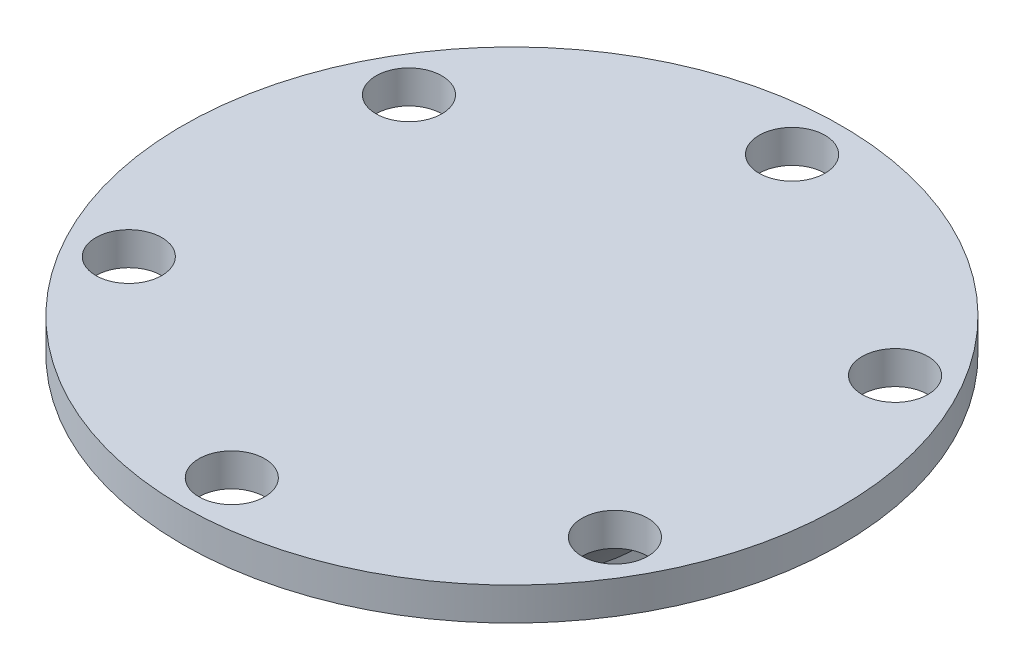
ISO-10303-21;
HEADER;
FILE_DESCRIPTION(('STEP AP214'),'2;1');
FILE_NAME('part.step','',(''),(''),'','','');
FILE_SCHEMA(('AUTOMOTIVE_DESIGN { 1 0 10303 214 1 1 1 1 }'));
ENDSEC;
DATA;
#1=APPLICATION_CONTEXT('core data for automotive mechanical design processes');
#2=APPLICATION_PROTOCOL_DEFINITION('international standard','automotive_design',2000,#1);
#3=PRODUCT_CONTEXT('',#1,'mechanical');
#4=PRODUCT('Part','Part','',(#3));
#5=PRODUCT_RELATED_PRODUCT_CATEGORY('part','',(#4));
#6=PRODUCT_DEFINITION_FORMATION('','',#4);
#7=PRODUCT_DEFINITION_CONTEXT('part definition',#1,'design');
#8=PRODUCT_DEFINITION('design','',#6,#7);
#9=PRODUCT_DEFINITION_SHAPE('','',#8);
#10=(LENGTH_UNIT() NAMED_UNIT(*) SI_UNIT(.MILLI.,.METRE.));
#11=(NAMED_UNIT(*) PLANE_ANGLE_UNIT() SI_UNIT($,.RADIAN.));
#12=(NAMED_UNIT(*) SI_UNIT($,.STERADIAN.) SOLID_ANGLE_UNIT());
#13=UNCERTAINTY_MEASURE_WITH_UNIT(LENGTH_MEASURE(1.E-05),#10,'distance_accuracy_value','');
#14=(GEOMETRIC_REPRESENTATION_CONTEXT(3) GLOBAL_UNCERTAINTY_ASSIGNED_CONTEXT((#13)) GLOBAL_UNIT_ASSIGNED_CONTEXT((#10,
#11,#12)) REPRESENTATION_CONTEXT('',''));
#15=CARTESIAN_POINT('',(0.,0.,0.));
#16=DIRECTION('',(0.,0.,1.));
#17=DIRECTION('',(1.,0.,0.));
#18=AXIS2_PLACEMENT_3D('',#15,#16,#17);
#19=CARTESIAN_POINT('',(0.,12.7,0.));
#20=DIRECTION('',(0.,-1.,0.));
#21=DIRECTION('',(0.,0.,-1.));
#22=AXIS2_PLACEMENT_3D('',#19,#20,#21);
#23=CYLINDRICAL_SURFACE('',#22,127.);
#24=CARTESIAN_POINT('',(0.,12.7,0.));
#25=DIRECTION('',(0.,1.,0.));
#26=DIRECTION('',(0.,0.,1.));
#27=AXIS2_PLACEMENT_3D('',#24,#25,#26);
#28=CIRCLE('',#27,127.);
#29=CARTESIAN_POINT('',(0.,12.7,127.));
#30=VERTEX_POINT('',#29);
#31=EDGE_CURVE('E42',#30,#30,#28,.T.);
#32=ORIENTED_EDGE('',*,*,#31,.F.);
#33=EDGE_LOOP('',(#32));
#34=FACE_BOUND('',#33,.T.);
#35=CARTESIAN_POINT('',(0.,0.,0.));
#36=DIRECTION('',(0.,1.,0.));
#37=DIRECTION('',(0.,0.,1.));
#38=AXIS2_PLACEMENT_3D('',#35,#36,#37);
#39=CIRCLE('',#38,127.);
#40=CARTESIAN_POINT('',(0.,0.,127.));
#41=VERTEX_POINT('',#40);
#42=EDGE_CURVE('E46',#41,#41,#39,.T.);
#43=ORIENTED_EDGE('',*,*,#42,.T.);
#44=EDGE_LOOP('',(#43));
#45=FACE_BOUND('',#44,.T.);
#46=ADVANCED_FACE('F31',(#34,#45),#23,.T.);
#47=CARTESIAN_POINT('',(0.,12.7,0.));
#48=DIRECTION('',(0.,1.,0.));
#49=DIRECTION('',(0.,0.,1.));
#50=AXIS2_PLACEMENT_3D('',#47,#48,#49);
#51=PLANE('',#50);
#52=CARTESIAN_POINT('',(0.,12.7,-107.95));
#53=DIRECTION('',(0.,1.,0.));
#54=DIRECTION('',(0.,0.,1.));
#55=AXIS2_PLACEMENT_3D('',#52,#53,#54);
#56=CIRCLE('',#55,12.7);
#57=CARTESIAN_POINT('',(0.,12.7,-95.25));
#58=VERTEX_POINT('',#57);
#59=EDGE_CURVE('E77',#58,#58,#56,.T.);
#60=ORIENTED_EDGE('',*,*,#59,.F.);
#61=EDGE_LOOP('',(#60));
#62=FACE_BOUND('',#61,.T.);
#63=CARTESIAN_POINT('',(-93.6625,12.7,53.975));
#64=DIRECTION('',(0.,1.,0.));
#65=DIRECTION('',(0.,0.,1.));
#66=AXIS2_PLACEMENT_3D('',#63,#64,#65);
#67=CIRCLE('',#66,12.7);
#68=CARTESIAN_POINT('',(-93.6625,12.7,66.675));
#69=VERTEX_POINT('',#68);
#70=EDGE_CURVE('E78',#69,#69,#67,.T.);
#71=ORIENTED_EDGE('',*,*,#70,.F.);
#72=EDGE_LOOP('',(#71));
#73=FACE_BOUND('',#72,.T.);
#74=CARTESIAN_POINT('',(-93.6625,12.7,-53.975));
#75=DIRECTION('',(0.,1.,0.));
#76=DIRECTION('',(0.,0.,1.));
#77=AXIS2_PLACEMENT_3D('',#74,#75,#76);
#78=CIRCLE('',#77,12.7);
#79=CARTESIAN_POINT('',(-93.6625,12.7,-41.275));
#80=VERTEX_POINT('',#79);
#81=EDGE_CURVE('E52',#80,#80,#78,.T.);
#82=ORIENTED_EDGE('',*,*,#81,.F.);
#83=EDGE_LOOP('',(#82));
#84=FACE_BOUND('',#83,.T.);
#85=CARTESIAN_POINT('',(93.6625,12.7,-53.975));
#86=DIRECTION('',(0.,1.,0.));
#87=DIRECTION('',(0.,0.,1.));
#88=AXIS2_PLACEMENT_3D('',#85,#86,#87);
#89=CIRCLE('',#88,12.7);
#90=CARTESIAN_POINT('',(93.6625,12.7,-41.275));
#91=VERTEX_POINT('',#90);
#92=EDGE_CURVE('E59',#91,#91,#89,.T.);
#93=ORIENTED_EDGE('',*,*,#92,.F.);
#94=EDGE_LOOP('',(#93));
#95=FACE_BOUND('',#94,.T.);
#96=CARTESIAN_POINT('',(93.6625,12.7,53.975));
#97=DIRECTION('',(0.,1.,0.));
#98=DIRECTION('',(0.,0.,1.));
#99=AXIS2_PLACEMENT_3D('',#96,#97,#98);
#100=CIRCLE('',#99,12.7);
#101=CARTESIAN_POINT('',(93.6625,12.7,66.675));
#102=VERTEX_POINT('',#101);
#103=EDGE_CURVE('E65',#102,#102,#100,.T.);
#104=ORIENTED_EDGE('',*,*,#103,.F.);
#105=EDGE_LOOP('',(#104));
#106=FACE_BOUND('',#105,.T.);
#107=CARTESIAN_POINT('',(0.,12.7,107.95));
#108=DIRECTION('',(0.,1.,0.));
#109=DIRECTION('',(0.,0.,1.));
#110=AXIS2_PLACEMENT_3D('',#107,#108,#109);
#111=CIRCLE('',#110,12.7);
#112=CARTESIAN_POINT('',(0.,12.7,120.65));
#113=VERTEX_POINT('',#112);
#114=EDGE_CURVE('E71',#113,#113,#111,.T.);
#115=ORIENTED_EDGE('',*,*,#114,.F.);
#116=EDGE_LOOP('',(#115));
#117=FACE_BOUND('',#116,.T.);
#118=ORIENTED_EDGE('',*,*,#31,.T.);
#119=EDGE_LOOP('',(#118));
#120=FACE_BOUND('',#119,.T.);
#121=ADVANCED_FACE('F104',(#62,#73,#84,#95,#106,#117,#120),#51,.T.);
#122=CARTESIAN_POINT('',(0.,0.,0.));
#123=DIRECTION('',(0.,1.,0.));
#124=DIRECTION('',(0.,0.,1.));
#125=AXIS2_PLACEMENT_3D('',#122,#123,#124);
#126=PLANE('',#125);
#127=CARTESIAN_POINT('',(0.,0.,0.));
#128=DIRECTION('',(0.,1.,0.));
#129=DIRECTION('',(0.,0.,1.));
#130=AXIS2_PLACEMENT_3D('',#127,#128,#129);
#131=CIRCLE('',#130,88.9);
#132=CARTESIAN_POINT('',(0.,0.,88.9));
#133=VERTEX_POINT('',#132);
#134=EDGE_CURVE('E38',#133,#133,#131,.F.);
#135=ORIENTED_EDGE('',*,*,#134,.F.);
#136=EDGE_LOOP('',(#135));
#137=FACE_BOUND('',#136,.T.);
#138=CARTESIAN_POINT('',(0.,0.,-107.95));
#139=DIRECTION('',(0.,1.,0.));
#140=DIRECTION('',(0.,0.,1.));
#141=AXIS2_PLACEMENT_3D('',#138,#139,#140);
#142=CIRCLE('',#141,12.7);
#143=CARTESIAN_POINT('',(0.,0.,-95.25));
#144=VERTEX_POINT('',#143);
#145=EDGE_CURVE('E50',#144,#144,#142,.T.);
#146=ORIENTED_EDGE('',*,*,#145,.T.);
#147=EDGE_LOOP('',(#146));
#148=FACE_BOUND('',#147,.T.);
#149=CARTESIAN_POINT('',(-93.6625,0.,53.975));
#150=DIRECTION('',(0.,1.,0.));
#151=DIRECTION('',(0.,0.,1.));
#152=AXIS2_PLACEMENT_3D('',#149,#150,#151);
#153=CIRCLE('',#152,12.7);
#154=CARTESIAN_POINT('',(-93.6625,0.,66.675));
#155=VERTEX_POINT('',#154);
#156=EDGE_CURVE('E56',#155,#155,#153,.T.);
#157=ORIENTED_EDGE('',*,*,#156,.T.);
#158=EDGE_LOOP('',(#157));
#159=FACE_BOUND('',#158,.T.);
#160=CARTESIAN_POINT('',(-93.6625,0.,-53.975));
#161=DIRECTION('',(0.,1.,0.));
#162=DIRECTION('',(0.,0.,1.));
#163=AXIS2_PLACEMENT_3D('',#160,#161,#162);
#164=CIRCLE('',#163,12.7);
#165=CARTESIAN_POINT('',(-93.6625,0.,-41.275));
#166=VERTEX_POINT('',#165);
#167=EDGE_CURVE('E55',#166,#166,#164,.T.);
#168=ORIENTED_EDGE('',*,*,#167,.T.);
#169=EDGE_LOOP('',(#168));
#170=FACE_BOUND('',#169,.T.);
#171=CARTESIAN_POINT('',(93.6625,0.,-53.975));
#172=DIRECTION('',(0.,1.,0.));
#173=DIRECTION('',(0.,0.,1.));
#174=AXIS2_PLACEMENT_3D('',#171,#172,#173);
#175=CIRCLE('',#174,12.7);
#176=CARTESIAN_POINT('',(93.6625,0.,-41.275));
#177=VERTEX_POINT('',#176);
#178=EDGE_CURVE('E62',#177,#177,#175,.T.);
#179=ORIENTED_EDGE('',*,*,#178,.T.);
#180=EDGE_LOOP('',(#179));
#181=FACE_BOUND('',#180,.T.);
#182=CARTESIAN_POINT('',(93.6625,0.,53.975));
#183=DIRECTION('',(0.,1.,0.));
#184=DIRECTION('',(0.,0.,1.));
#185=AXIS2_PLACEMENT_3D('',#182,#183,#184);
#186=CIRCLE('',#185,12.7);
#187=CARTESIAN_POINT('',(93.6625,0.,66.675));
#188=VERTEX_POINT('',#187);
#189=EDGE_CURVE('E68',#188,#188,#186,.T.);
#190=ORIENTED_EDGE('',*,*,#189,.T.);
#191=EDGE_LOOP('',(#190));
#192=FACE_BOUND('',#191,.T.);
#193=CARTESIAN_POINT('',(0.,0.,107.95));
#194=DIRECTION('',(0.,1.,0.));
#195=DIRECTION('',(0.,0.,1.));
#196=AXIS2_PLACEMENT_3D('',#193,#194,#195);
#197=CIRCLE('',#196,12.7);
#198=CARTESIAN_POINT('',(0.,0.,120.65));
#199=VERTEX_POINT('',#198);
#200=EDGE_CURVE('E74',#199,#199,#197,.T.);
#201=ORIENTED_EDGE('',*,*,#200,.T.);
#202=EDGE_LOOP('',(#201));
#203=FACE_BOUND('',#202,.T.);
#204=ORIENTED_EDGE('',*,*,#42,.F.);
#205=EDGE_LOOP('',(#204));
#206=FACE_BOUND('',#205,.T.);
#207=ADVANCED_FACE('F109',(#137,#148,#159,#170,#181,#192,#203,#206),#126,.F.);
#208=CARTESIAN_POINT('',(0.,0.,107.95));
#209=DIRECTION('',(0.,1.,0.));
#210=DIRECTION('',(0.,0.,1.));
#211=AXIS2_PLACEMENT_3D('',#208,#209,#210);
#212=CYLINDRICAL_SURFACE('',#211,12.7);
#213=ORIENTED_EDGE('',*,*,#200,.F.);
#214=EDGE_LOOP('',(#213));
#215=FACE_BOUND('',#214,.T.);
#216=ORIENTED_EDGE('',*,*,#114,.T.);
#217=EDGE_LOOP('',(#216));
#218=FACE_BOUND('',#217,.T.);
#219=ADVANCED_FACE('F116',(#215,#218),#212,.F.);
#220=CARTESIAN_POINT('',(93.6625,0.,53.975));
#221=DIRECTION('',(0.,1.,0.));
#222=DIRECTION('',(0.,0.,1.));
#223=AXIS2_PLACEMENT_3D('',#220,#221,#222);
#224=CYLINDRICAL_SURFACE('',#223,12.7);
#225=ORIENTED_EDGE('',*,*,#189,.F.);
#226=EDGE_LOOP('',(#225));
#227=FACE_BOUND('',#226,.T.);
#228=ORIENTED_EDGE('',*,*,#103,.T.);
#229=EDGE_LOOP('',(#228));
#230=FACE_BOUND('',#229,.T.);
#231=ADVANCED_FACE('F127',(#227,#230),#224,.F.);
#232=CARTESIAN_POINT('',(93.6625,0.,-53.975));
#233=DIRECTION('',(0.,1.,0.));
#234=DIRECTION('',(0.,0.,1.));
#235=AXIS2_PLACEMENT_3D('',#232,#233,#234);
#236=CYLINDRICAL_SURFACE('',#235,12.7);
#237=ORIENTED_EDGE('',*,*,#178,.F.);
#238=EDGE_LOOP('',(#237));
#239=FACE_BOUND('',#238,.T.);
#240=ORIENTED_EDGE('',*,*,#92,.T.);
#241=EDGE_LOOP('',(#240));
#242=FACE_BOUND('',#241,.T.);
#243=ADVANCED_FACE('F123',(#239,#242),#236,.F.);
#244=CARTESIAN_POINT('',(-93.6625,0.,-53.975));
#245=DIRECTION('',(0.,1.,0.));
#246=DIRECTION('',(0.,0.,1.));
#247=AXIS2_PLACEMENT_3D('',#244,#245,#246);
#248=CYLINDRICAL_SURFACE('',#247,12.7);
#249=ORIENTED_EDGE('',*,*,#167,.F.);
#250=EDGE_LOOP('',(#249));
#251=FACE_BOUND('',#250,.T.);
#252=ORIENTED_EDGE('',*,*,#81,.T.);
#253=EDGE_LOOP('',(#252));
#254=FACE_BOUND('',#253,.T.);
#255=ADVANCED_FACE('F119',(#251,#254),#248,.F.);
#256=CARTESIAN_POINT('',(-93.6625,0.,53.975));
#257=DIRECTION('',(0.,1.,0.));
#258=DIRECTION('',(0.,0.,1.));
#259=AXIS2_PLACEMENT_3D('',#256,#257,#258);
#260=CYLINDRICAL_SURFACE('',#259,12.7);
#261=ORIENTED_EDGE('',*,*,#156,.F.);
#262=EDGE_LOOP('',(#261));
#263=FACE_BOUND('',#262,.T.);
#264=ORIENTED_EDGE('',*,*,#70,.T.);
#265=EDGE_LOOP('',(#264));
#266=FACE_BOUND('',#265,.T.);
#267=ADVANCED_FACE('F122',(#263,#266),#260,.F.);
#268=CARTESIAN_POINT('',(0.,0.,-107.95));
#269=DIRECTION('',(0.,1.,0.));
#270=DIRECTION('',(0.,0.,1.));
#271=AXIS2_PLACEMENT_3D('',#268,#269,#270);
#272=CYLINDRICAL_SURFACE('',#271,12.7);
#273=ORIENTED_EDGE('',*,*,#145,.F.);
#274=EDGE_LOOP('',(#273));
#275=FACE_BOUND('',#274,.T.);
#276=ORIENTED_EDGE('',*,*,#59,.T.);
#277=EDGE_LOOP('',(#276));
#278=FACE_BOUND('',#277,.T.);
#279=ADVANCED_FACE('F101',(#275,#278),#272,.F.);
#280=CARTESIAN_POINT('',(0.,-39.6875,0.));
#281=DIRECTION('',(0.,1.,0.));
#282=DIRECTION('',(0.,0.,1.));
#283=AXIS2_PLACEMENT_3D('',#280,#281,#282);
#284=CONICAL_SURFACE('',#283,49.2125000000001,0.785398163397448);
#285=ORIENTED_EDGE('',*,*,#134,.T.);
#286=EDGE_LOOP('',(#285));
#287=FACE_BOUND('',#286,.T.);
#288=CARTESIAN_POINT('',(0.,-39.6875,0.));
#289=DIRECTION('',(0.,-1.,0.));
#290=DIRECTION('',(0.,0.,-1.));
#291=AXIS2_PLACEMENT_3D('',#288,#289,#290);
#292=CIRCLE('',#291,49.2125000000001);
#293=CARTESIAN_POINT('',(0.,-39.6875,49.2125000000001));
#294=VERTEX_POINT('',#293);
#295=EDGE_CURVE('E10',#294,#294,#292,.T.);
#296=ORIENTED_EDGE('',*,*,#295,.F.);
#297=EDGE_LOOP('',(#296));
#298=FACE_BOUND('',#297,.T.);
#299=ADVANCED_FACE('F33',(#287,#298),#284,.T.);
#300=CARTESIAN_POINT('',(0.,-44.45,0.));
#301=DIRECTION('',(0.,1.,0.));
#302=DIRECTION('',(0.,0.,1.));
#303=AXIS2_PLACEMENT_3D('',#300,#301,#302);
#304=CYLINDRICAL_SURFACE('',#303,49.2125000000001);
#305=CARTESIAN_POINT('',(0.,-44.45,0.));
#306=DIRECTION('',(0.,-1.,0.));
#307=DIRECTION('',(0.,0.,-1.));
#308=AXIS2_PLACEMENT_3D('',#305,#306,#307);
#309=CIRCLE('',#308,49.2125000000001);
#310=CARTESIAN_POINT('',(0.,-44.45,49.2125000000001));
#311=VERTEX_POINT('',#310);
#312=EDGE_CURVE('E81',#311,#311,#309,.T.);
#313=CARTESIAN_POINT('',(0.,-44.45,49.2125000000001));
#314=CARTESIAN_POINT('',(0.,-44.400390625,49.2125000000001));
#315=CARTESIAN_POINT('',(0.,-44.35078125,49.2125000000001));
#316=CARTESIAN_POINT('',(0.,-44.2515625,49.2125000000001));
#317=CARTESIAN_POINT('',(0.,-44.201953125,49.2125000000001));
#318=CARTESIAN_POINT('',(0.,-44.102734375,49.2125000000001));
#319=CARTESIAN_POINT('',(0.,-44.053125,49.2125000000001));
#320=CARTESIAN_POINT('',(0.,-43.95390625,49.2125000000001));
#321=CARTESIAN_POINT('',(0.,-43.904296875,49.2125000000001));
#322=CARTESIAN_POINT('',(0.,-43.805078125,49.2125000000001));
#323=CARTESIAN_POINT('',(0.,-43.75546875,49.2125000000001));
#324=CARTESIAN_POINT('',(0.,-43.65625,49.2125000000001));
#325=CARTESIAN_POINT('',(0.,-43.606640625,49.2125000000001));
#326=CARTESIAN_POINT('',(0.,-43.507421875,49.2125000000001));
#327=CARTESIAN_POINT('',(0.,-43.4578125,49.2125000000001));
#328=CARTESIAN_POINT('',(0.,-43.35859375,49.2125000000001));
#329=CARTESIAN_POINT('',(0.,-43.308984375,49.2125000000001));
#330=CARTESIAN_POINT('',(0.,-43.209765625,49.2125000000001));
#331=CARTESIAN_POINT('',(0.,-43.16015625,49.2125000000001));
#332=CARTESIAN_POINT('',(0.,-43.0609375,49.2125000000001));
#333=CARTESIAN_POINT('',(0.,-43.011328125,49.2125000000001));
#334=CARTESIAN_POINT('',(0.,-42.912109375,49.2125000000001));
#335=CARTESIAN_POINT('',(0.,-42.8625,49.2125000000001));
#336=CARTESIAN_POINT('',(0.,-42.76328125,49.2125000000001));
#337=CARTESIAN_POINT('',(0.,-42.713671875,49.2125000000001));
#338=CARTESIAN_POINT('',(0.,-42.614453125,49.2125000000001));
#339=CARTESIAN_POINT('',(0.,-42.56484375,49.2125000000001));
#340=CARTESIAN_POINT('',(0.,-42.465625,49.2125000000001));
#341=CARTESIAN_POINT('',(0.,-42.416015625,49.2125000000001));
#342=CARTESIAN_POINT('',(0.,-42.316796875,49.2125000000001));
#343=CARTESIAN_POINT('',(0.,-42.2671875,49.2125000000001));
#344=CARTESIAN_POINT('',(0.,-42.16796875,49.2125000000001));
#345=CARTESIAN_POINT('',(0.,-42.118359375,49.2125000000001));
#346=CARTESIAN_POINT('',(0.,-42.019140625,49.2125000000001));
#347=CARTESIAN_POINT('',(0.,-41.96953125,49.2125000000001));
#348=CARTESIAN_POINT('',(0.,-41.8703125,49.2125000000001));
#349=CARTESIAN_POINT('',(0.,-41.820703125,49.2125000000001));
#350=CARTESIAN_POINT('',(0.,-41.721484375,49.2125000000001));
#351=CARTESIAN_POINT('',(0.,-41.671875,49.2125000000001));
#352=CARTESIAN_POINT('',(0.,-41.57265625,49.2125000000001));
#353=CARTESIAN_POINT('',(0.,-41.523046875,49.2125000000001));
#354=CARTESIAN_POINT('',(0.,-41.423828125,49.2125000000001));
#355=CARTESIAN_POINT('',(0.,-41.37421875,49.2125000000001));
#356=CARTESIAN_POINT('',(0.,-41.275,49.2125000000001));
#357=CARTESIAN_POINT('',(0.,-41.225390625,49.2125000000001));
#358=CARTESIAN_POINT('',(0.,-41.126171875,49.2125000000001));
#359=CARTESIAN_POINT('',(0.,-41.0765625,49.2125000000001));
#360=CARTESIAN_POINT('',(0.,-40.97734375,49.2125000000001));
#361=CARTESIAN_POINT('',(0.,-40.927734375,49.2125000000001));
#362=CARTESIAN_POINT('',(0.,-40.828515625,49.2125000000001));
#363=CARTESIAN_POINT('',(0.,-40.77890625,49.2125000000001));
#364=CARTESIAN_POINT('',(0.,-40.6796875,49.2125000000001));
#365=CARTESIAN_POINT('',(0.,-40.630078125,49.2125000000001));
#366=CARTESIAN_POINT('',(0.,-40.530859375,49.2125000000001));
#367=CARTESIAN_POINT('',(0.,-40.48125,49.2125000000001));
#368=CARTESIAN_POINT('',(0.,-40.38203125,49.2125000000001));
#369=CARTESIAN_POINT('',(0.,-40.332421875,49.2125000000001));
#370=CARTESIAN_POINT('',(0.,-40.233203125,49.2125000000001));
#371=CARTESIAN_POINT('',(0.,-40.18359375,49.2125000000001));
#372=CARTESIAN_POINT('',(0.,-40.084375,49.2125000000001));
#373=CARTESIAN_POINT('',(0.,-40.034765625,49.2125000000001));
#374=CARTESIAN_POINT('',(0.,-39.935546875,49.2125000000001));
#375=CARTESIAN_POINT('',(0.,-39.8859375,49.2125000000001));
#376=CARTESIAN_POINT('',(0.,-39.78671875,49.2125000000001));
#377=CARTESIAN_POINT('',(0.,-39.737109375,49.2125000000001));
#378=CARTESIAN_POINT('',(0.,-39.6875,49.2125000000001));
#379=B_SPLINE_CURVE_WITH_KNOTS('',3,(#313,#314,#315,#316,#317,#318,#319,#320,#321,#322,#323,
#324,#325,#326,#327,#328,#329,#330,#331,#332,#333,#334,#335,#336,#337,#338,#339,#340,#341,#342,
#343,#344,#345,#346,#347,#348,#349,#350,#351,#352,#353,#354,#355,#356,#357,#358,#359,#360,#361,
#362,#363,#364,#365,#366,#367,#368,#369,#370,#371,#372,#373,#374,#375,#376,#377,#378),
.UNSPECIFIED.,.F.,.F.,(4,2,2,2,2,2,2,2,2,2,2,2,2,2,2,2,2,2,2,2,2,2,2,2,2,2,2,2,2,2,2,2,4),(0.,
0.148828125,0.29765625,0.446484375,0.5953125,0.744140625,0.892968750000001,1.041796875,1.190625,
1.339453125,1.48828125,1.637109375,1.7859375,1.934765625,2.08359375,2.232421875,2.38125,
2.530078125,2.67890625,2.827734375,2.9765625,3.125390625,3.27421875,3.423046875,3.571875,
3.720703125,3.86953125,4.018359375,4.1671875,4.316015625,4.46484375,4.613671875,4.7625),.UNSPECIFIED.);
#380=EDGE_CURVE('BSEAM93',#311,#294,#379,.T.);
#381=ORIENTED_EDGE('',*,*,#312,.F.);
#382=ORIENTED_EDGE('',*,*,#295,.T.);
#383=ORIENTED_EDGE('',*,*,#380,.T.);
#384=ORIENTED_EDGE('',*,*,#380,.F.);
#385=EDGE_LOOP('',(#381,#383,#382,#384));
#386=FACE_BOUND('',#385,.T.);
#387=ADVANCED_FACE('F93',(#386),#304,.T.);
#388=CARTESIAN_POINT('',(0.,-44.45,0.));
#389=DIRECTION('',(0.,-1.,0.));
#390=DIRECTION('',(0.,0.,-1.));
#391=AXIS2_PLACEMENT_3D('',#388,#389,#390);
#392=PLANE('',#391);
#393=ORIENTED_EDGE('',*,*,#312,.T.);
#394=EDGE_LOOP('',(#393));
#395=FACE_BOUND('',#394,.T.);
#396=ADVANCED_FACE('F91',(#395),#392,.T.);
#397=CLOSED_SHELL('',(#46,#121,#207,#219,#231,#243,#255,#267,#279,#299,#387,#396));
#398=MANIFOLD_SOLID_BREP('B2',#397);
#399=ADVANCED_BREP_SHAPE_REPRESENTATION('',(#18,#398),#14);
#400=SHAPE_DEFINITION_REPRESENTATION(#9,#399);
ENDSEC;
END-ISO-10303-21;
